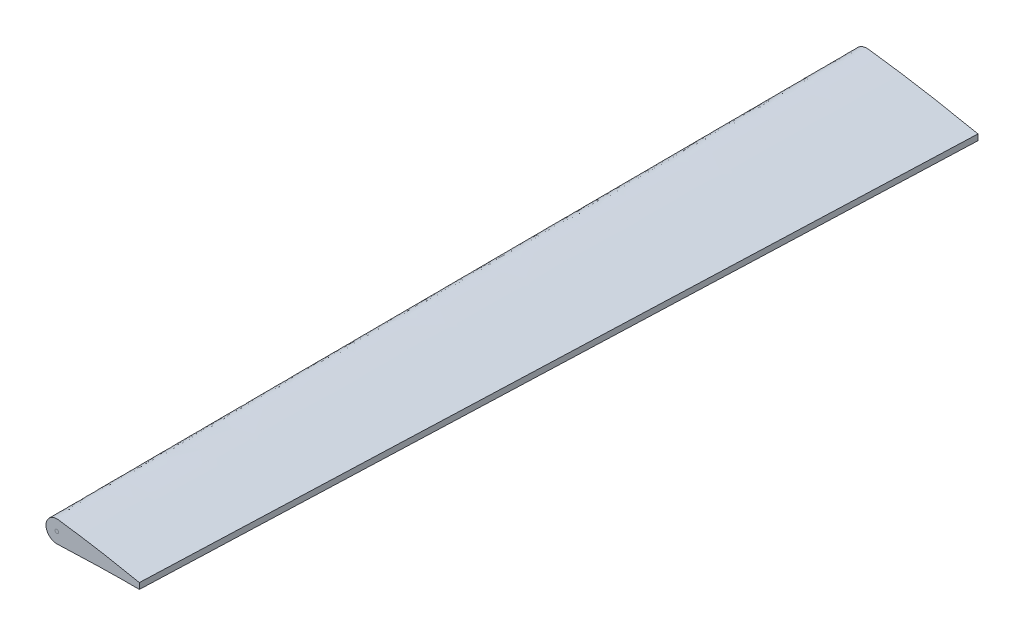
ISO-10303-21;
HEADER;
FILE_DESCRIPTION(('STEP AP214'),'2;1');
FILE_NAME('part.step','',(''),(''),'','','');
FILE_SCHEMA(('AUTOMOTIVE_DESIGN { 1 0 10303 214 1 1 1 1 }'));
ENDSEC;
DATA;
#1=APPLICATION_CONTEXT('core data for automotive mechanical design processes');
#2=APPLICATION_PROTOCOL_DEFINITION('international standard','automotive_design',2000,#1);
#3=PRODUCT_CONTEXT('',#1,'mechanical');
#4=PRODUCT('Part','Part','',(#3));
#5=PRODUCT_RELATED_PRODUCT_CATEGORY('part','',(#4));
#6=PRODUCT_DEFINITION_FORMATION('','',#4);
#7=PRODUCT_DEFINITION_CONTEXT('part definition',#1,'design');
#8=PRODUCT_DEFINITION('design','',#6,#7);
#9=PRODUCT_DEFINITION_SHAPE('','',#8);
#10=(LENGTH_UNIT() NAMED_UNIT(*) SI_UNIT(.MILLI.,.METRE.));
#11=(NAMED_UNIT(*) PLANE_ANGLE_UNIT() SI_UNIT($,.RADIAN.));
#12=(NAMED_UNIT(*) SI_UNIT($,.STERADIAN.) SOLID_ANGLE_UNIT());
#13=UNCERTAINTY_MEASURE_WITH_UNIT(LENGTH_MEASURE(1.E-05),#10,'distance_accuracy_value','');
#14=(GEOMETRIC_REPRESENTATION_CONTEXT(3) GLOBAL_UNCERTAINTY_ASSIGNED_CONTEXT((#13)) GLOBAL_UNIT_ASSIGNED_CONTEXT((#10,
#11,#12)) REPRESENTATION_CONTEXT('',''));
#15=CARTESIAN_POINT('',(0.,0.,0.));
#16=DIRECTION('',(0.,0.,1.));
#17=DIRECTION('',(1.,0.,0.));
#18=AXIS2_PLACEMENT_3D('',#15,#16,#17);
#19=CARTESIAN_POINT('',(183.169208283257,0.820924364598228,768.));
#20=DIRECTION('',(0.,0.,1.));
#21=DIRECTION('',(1.,0.,0.));
#22=AXIS2_PLACEMENT_3D('',#19,#20,#21);
#23=PLANE('',#22);
#24=CARTESIAN_POINT('',(206.591453535194,1.05306337090673,768.));
#25=CARTESIAN_POINT('',(206.072820369748,1.05867440583243,768.));
#26=CARTESIAN_POINT('',(205.554177136032,1.0633161421897,768.));
#27=CARTESIAN_POINT('',(204.516886984971,1.07076784708305,768.));
#28=CARTESIAN_POINT('',(203.998240067869,1.07357784930354,768.));
#29=CARTESIAN_POINT('',(202.96094494634,1.07747309489996,768.));
#30=CARTESIAN_POINT('',(202.442296741974,1.07855835496654,768.));
#31=CARTESIAN_POINT('',(201.405001150341,1.07911364602215,768.));
#32=CARTESIAN_POINT('',(200.886353763077,1.07858368193419,768.));
#33=CARTESIAN_POINT('',(199.849126637541,1.07601966145861,768.));
#34=CARTESIAN_POINT('',(199.330546898798,1.07398579015506,768.));
#35=CARTESIAN_POINT('',(198.293392480551,1.06852753866215,768.));
#36=CARTESIAN_POINT('',(197.774817801081,1.06510315214495,768.));
#37=CARTESIAN_POINT('',(196.737675534649,1.05697607318987,768.));
#38=CARTESIAN_POINT('',(196.219107947746,1.05227337332798,768.));
#39=CARTESIAN_POINT('',(195.181981838538,1.04171335205491,768.));
#40=CARTESIAN_POINT('',(194.663423316298,1.03585602436697,768.));
#41=CARTESIAN_POINT('',(193.315332111451,1.01923149482881,768.));
#42=CARTESIAN_POINT('',(192.485809654009,1.00762641888703,768.));
#43=CARTESIAN_POINT('',(190.826803609353,0.981814051540755,768.));
#44=CARTESIAN_POINT('',(189.997320022235,0.967606754103718,768.));
#45=CARTESIAN_POINT('',(188.338401634199,0.936763396129812,768.));
#46=CARTESIAN_POINT('',(187.508966833091,0.920127345826862,768.));
#47=CARTESIAN_POINT('',(185.850156167595,0.884597503648131,768.));
#48=CARTESIAN_POINT('',(185.020780302598,0.865703740099101,768.));
#49=CARTESIAN_POINT('',(183.362097422564,0.825837551664779,768.));
#50=CARTESIAN_POINT('',(182.532790406394,0.804865173747965,768.));
#51=CARTESIAN_POINT('',(180.873840319434,0.760994914159579,768.));
#52=CARTESIAN_POINT('',(180.04419727233,0.738096138887323,768.));
#53=CARTESIAN_POINT('',(178.384965146644,0.69053701485564,768.));
#54=CARTESIAN_POINT('',(177.555376067858,0.665876673233914,768.));
#55=CARTESIAN_POINT('',(175.896224118894,0.614953282205181,768.));
#56=CARTESIAN_POINT('',(175.066661250086,0.588690188263759,768.));
#57=CARTESIAN_POINT('',(173.407533971921,0.534720234276648,768.));
#58=CARTESIAN_POINT('',(172.577969565317,0.507013289808912,768.));
#59=CARTESIAN_POINT('',(170.918811327994,0.450316349264842,768.));
#60=CARTESIAN_POINT('',(170.089217501141,0.421326240146729,768.));
#61=CARTESIAN_POINT('',(168.976619497581,0.381681373079313,768.));
#62=CARTESIAN_POINT('',(168.693597292334,0.371530118190689,768.));
#63=CARTESIAN_POINT('',(168.127564996039,0.351100736342839,768.));
#64=CARTESIAN_POINT('',(167.844554904869,0.340822612766523,768.));
#65=CARTESIAN_POINT('',(167.278566031405,0.320145778385204,768.));
#66=CARTESIAN_POINT('',(166.99558724869,0.3097470791199,768.));
#67=CARTESIAN_POINT('',(166.429680176882,0.288835388437905,768.));
#68=CARTESIAN_POINT('',(166.14675188709,0.278322415961064,768.));
#69=CARTESIAN_POINT('',(165.580964987495,0.257188499596321,768.));
#70=CARTESIAN_POINT('',(165.298106376737,0.246567581290027,768.));
#71=CARTESIAN_POINT('',(164.732946642127,0.225241790940742,768.));
#72=CARTESIAN_POINT('',(164.45064551054,0.21453712386274,768.));
#73=CARTESIAN_POINT('',(163.886049357314,0.193028934324901,768.));
#74=CARTESIAN_POINT('',(163.603754335644,0.182225412685229,768.));
#75=CARTESIAN_POINT('',(163.039086756215,0.160521780542396,768.));
#76=CARTESIAN_POINT('',(162.756714199488,0.149621643172512,768.));
#77=CARTESIAN_POINT('',(162.191807908338,0.127726932793038,768.));
#78=CARTESIAN_POINT('',(161.909274175904,0.116732308441278,768.));
#79=CARTESIAN_POINT('',(161.343961896253,0.0946506534488053,768.));
#80=CARTESIAN_POINT('',(161.061183351874,0.0835635501553543,767.999999999999));
#81=CARTESIAN_POINT('',(160.690217538675,0.0689680083080822,768.));
#82=CARTESIAN_POINT('',(160.602028895653,0.0654944843248972,768.));
#83=CARTESIAN_POINT('',(160.425672698019,0.0585408600535823,768.));
#84=CARTESIAN_POINT('',(160.337505143337,0.055060761509368,768.));
#85=CARTESIAN_POINT('',(160.205290517871,0.0498367564630603,768.));
#86=CARTESIAN_POINT('',(160.161243343818,0.0480955011263788,768.));
#87=CARTESIAN_POINT('',(160.073147893504,0.0446109919486474,768.));
#88=CARTESIAN_POINT('',(160.029099617245,0.0428677380550966,768.));
#89=CARTESIAN_POINT('',(159.963058023809,0.0402532658392141,768.));
#90=CARTESIAN_POINT('',(159.941064698435,0.0393824533322958,768.));
#91=CARTESIAN_POINT('',(159.897077933674,0.0376394651725113,768.));
#92=CARTESIAN_POINT('',(159.875084494288,0.036767289507545,768.));
#93=CARTESIAN_POINT('',(159.842094645182,0.0354613562913556,768.));
#94=CARTESIAN_POINT('',(159.831098322245,0.0350264431362004,768.));
#95=CARTESIAN_POINT('',(159.809103192503,0.0342257583594533,768.));
#96=CARTESIAN_POINT('',(159.798104385713,0.0338599863266866,768.));
#97=CARTESIAN_POINT('',(159.765105703501,0.0328495154791118,768.));
#98=CARTESIAN_POINT('',(159.743103124341,0.0322916437264463,768.));
#99=CARTESIAN_POINT('',(159.69912456846,0.0314161836012234,768.));
#100=CARTESIAN_POINT('',(159.677148598521,0.0310982538845143,768.));
#101=CARTESIAN_POINT('',(159.633194167735,0.0306984195770186,768.));
#102=CARTESIAN_POINT('',(159.611215706853,0.0306165190008396,768.));
#103=CARTESIAN_POINT('',(159.545278869385,0.0307248188621574,768.));
#104=CARTESIAN_POINT('',(159.501320929616,0.0312690584065311,768.));
#105=CARTESIAN_POINT('',(159.369473906469,0.0343107130913118,768.));
#106=CARTESIAN_POINT('',(159.281613420923,0.0382170997001289,768.));
#107=CARTESIAN_POINT('',(159.106106785381,0.0497572538106592,768.));
#108=CARTESIAN_POINT('',(159.018460730941,0.0573924559545201,768.));
#109=CARTESIAN_POINT('',(158.84333121197,0.0763896327496934,768.));
#110=CARTESIAN_POINT('',(158.755848840588,0.0877617019287249,768.));
#111=CARTESIAN_POINT('',(158.581003783088,0.114270513879277,768.));
#112=CARTESIAN_POINT('',(158.49364393936,0.129426003540455,768.));
#113=CARTESIAN_POINT('',(158.319004642312,0.163578653169794,768.));
#114=CARTESIAN_POINT('',(158.231730605426,0.182603510752836,768.));
#115=CARTESIAN_POINT('',(158.144907160942,0.203503493131069,768.));
#116=B_SPLINE_CURVE_WITH_KNOTS('',3,(#24,#25,#26,#27,#28,#29,#30,#31,#32,#33,#34,#35,#36,#37,
#38,#39,#40,#41,#42,#43,#44,#45,#46,#47,#48,#49,#50,#51,#52,#53,#54,#55,#56,#57,#58,#59,#60,#61,
#62,#63,#64,#65,#66,#67,#68,#69,#70,#71,#72,#73,#74,#75,#76,#77,#78,#79,#80,#81,#82,#83,#84,#85,
#86,#87,#88,#89,#90,#91,#92,#93,#94,#95,#96,#97,#98,#99,#100,#101,#102,#103,#104,#105,#106,#107,
#108,#109,#110,#111,#112,#113,#114,#115),.UNSPECIFIED.,.F.,.F.,(4,2,2,2,2,2,2,2,2,2,2,2,2,2,2,2,
2,2,2,2,2,2,2,2,2,2,2,2,2,2,2,2,2,2,2,2,2,2,2,2,2,2,2,2,2,4),(0.,1.55598903548552,
3.11194945651517,4.66789482012995,6.22383544140583,7.77958460678026,9.33534085201238,
10.8911061327256,12.4468798710862,14.9356861157761,17.4244981301649,19.91329965787,
22.4020699627166,24.8907840439977,27.380659002332,29.8705238724998,32.3604579581076,
34.8505377940551,37.3408374345977,38.1904500068482,39.0400399731991,39.8895492898477,
40.7389198914492,41.5880936920454,42.435605720314,43.2831107234148,44.1308592942115,
44.9791020093599,45.8280894305099,46.0928604990676,46.357569131728,46.4898138622224,
46.6220621501826,46.6880938080644,46.75412605545,46.7871407274061,46.8201552030213,
46.8861828275104,46.952116342396,47.0180509787349,47.149925926152,47.4136812225375,
47.677538077426,47.9421136392906,48.2080271420873,48.4759156955911),.UNSPECIFIED.);
#117=CARTESIAN_POINT('',(159.83467645605,0.0351704092079654,768.));
#118=VERTEX_POINT('',#117);
#119=CARTESIAN_POINT('',(206.591453535194,1.05306337090673,768.));
#120=VERTEX_POINT('',#119);
#121=EDGE_CURVE('E374',#118,#120,#116,.F.);
#122=ORIENTED_EDGE('',*,*,#121,.T.);
#123=CARTESIAN_POINT('',(206.591453535194,1.05306337090673,768.));
#124=CARTESIAN_POINT('',(206.59145348529,1.33708285130722,767.999999999999));
#125=CARTESIAN_POINT('',(206.591453435962,1.62110233170771,767.999999999999));
#126=CARTESIAN_POINT('',(206.591453338523,2.18914129250869,767.999999999999));
#127=CARTESIAN_POINT('',(206.591453290412,2.47316077290919,768.));
#128=CARTESIAN_POINT('',(206.591453148017,3.32514661437409,768.000000000001));
#129=CARTESIAN_POINT('',(206.591453055657,3.8931129754385,768.000000000001));
#130=CARTESIAN_POINT('',(206.591452966129,4.46107933650291,768.));
#131=B_SPLINE_CURVE_WITH_KNOTS('',3,(#123,#124,#125,#126,#127,#128,#129,#130),.UNSPECIFIED.,.F.,
.F.,(4,2,2,4),(0.,0.85205844120149,1.70411688240298,3.40801596559624),.UNSPECIFIED.);
#132=CARTESIAN_POINT('',(206.591452966129,4.46107933650291,768.));
#133=VERTEX_POINT('',#132);
#134=EDGE_CURVE('E297',#120,#133,#131,.T.);
#135=ORIENTED_EDGE('',*,*,#134,.T.);
#136=CARTESIAN_POINT('',(206.591452966129,4.46107933650292,768.));
#137=CARTESIAN_POINT('',(206.083078798756,4.56448700045728,768.));
#138=CARTESIAN_POINT('',(205.574648445436,4.66761898848147,768.));
#139=CARTESIAN_POINT('',(204.557662273205,4.87325122317258,768.));
#140=CARTESIAN_POINT('',(204.04910645484,4.97575147252779,768.));
#141=CARTESIAN_POINT('',(203.031853837755,5.18004033919768,768.));
#142=CARTESIAN_POINT('',(202.523157039572,5.28182895918088,768.));
#143=CARTESIAN_POINT('',(201.50560691949,5.48461411873232,768.));
#144=CARTESIAN_POINT('',(200.996753597999,5.5856106603473,768.));
#145=CARTESIAN_POINT('',(199.979270916367,5.78665283082509,768.));
#146=CARTESIAN_POINT('',(199.470641690508,5.88669913909788,768.));
#147=CARTESIAN_POINT('',(198.453195768865,6.08583927334171,768.));
#148=CARTESIAN_POINT('',(197.944379072729,6.18493309751051,768.));
#149=CARTESIAN_POINT('',(196.926542922172,6.38208897618703,768.));
#150=CARTESIAN_POINT('',(196.417523466682,6.48015102517213,768.));
#151=CARTESIAN_POINT('',(195.399265151797,6.67515634285472,768.));
#152=CARTESIAN_POINT('',(194.890026290307,6.77209960061107,768.));
#153=CARTESIAN_POINT('',(193.565603619266,7.02264780906548,768.));
#154=CARTESIAN_POINT('',(192.750246355657,7.17533699847492,768.));
#155=CARTESIAN_POINT('',(191.118955838585,7.47764278554496,768.));
#156=CARTESIAN_POINT('',(190.30302258063,7.62725935896011,768.));
#157=CARTESIAN_POINT('',(188.670588460438,7.92333464370465,768.));
#158=CARTESIAN_POINT('',(187.85408760179,8.06979337481643,768.));
#159=CARTESIAN_POINT('',(186.22052873465,8.35947768197156,768.));
#160=CARTESIAN_POINT('',(185.403470737239,8.5027033204891,768.));
#161=CARTESIAN_POINT('',(183.768806561033,8.78583761756946,768.));
#162=CARTESIAN_POINT('',(182.95120040025,8.92574638010503,768.));
#163=CARTESIAN_POINT('',(181.31465225983,9.20235703400903,768.));
#164=CARTESIAN_POINT('',(180.495709747693,9.33905577483791,768.));
#165=CARTESIAN_POINT('',(178.85727836153,9.60912602272326,768.));
#166=CARTESIAN_POINT('',(178.037789488838,9.74249753787904,768.));
#167=CARTESIAN_POINT('',(176.398253157723,10.00592917581,768.));
#168=CARTESIAN_POINT('',(175.578205682494,10.1359891939965,768.));
#169=CARTESIAN_POINT('',(173.93754082764,10.392818345091,768.));
#170=CARTESIAN_POINT('',(173.116923414305,10.5195872626101,768.));
#171=CARTESIAN_POINT('',(171.475107401631,10.7698583588899,768.));
#172=CARTESIAN_POINT('',(170.653908752905,10.8933602138413,768.));
#173=CARTESIAN_POINT('',(169.485561738676,11.0666879592903,768.));
#174=CARTESIAN_POINT('',(169.138612653833,11.1178602224276,768.));
#175=CARTESIAN_POINT('',(168.444648469133,11.2196175370171,768.));
#176=CARTESIAN_POINT('',(168.097633374147,11.2702026216728,768.));
#177=CARTESIAN_POINT('',(167.403575186489,11.3707806729824,768.));
#178=CARTESIAN_POINT('',(167.056532107614,11.4207737348645,768.));
#179=CARTESIAN_POINT('',(166.362455932337,11.5201631693686,768.));
#180=CARTESIAN_POINT('',(166.015422858436,11.5695596991235,768.));
#181=CARTESIAN_POINT('',(165.32196636535,11.6676723931759,768.));
#182=CARTESIAN_POINT('',(164.975543110315,11.7163897177107,768.));
#183=CARTESIAN_POINT('',(164.282588934173,11.8132485964411,768.));
#184=CARTESIAN_POINT('',(163.936058006833,11.8613901060366,768.));
#185=CARTESIAN_POINT('',(163.242740594746,11.9571185217958,768.));
#186=CARTESIAN_POINT('',(162.895954069487,12.0047051345231,768.));
#187=CARTESIAN_POINT('',(162.201977402369,12.0993440395721,768.));
#188=CARTESIAN_POINT('',(161.854787186583,12.1463957899791,767.999999999999));
#189=CARTESIAN_POINT('',(161.415564265062,12.2055472264555,768.));
#190=CARTESIAN_POINT('',(161.323567748057,12.2179159863072,768.));
#191=CARTESIAN_POINT('',(161.185578718345,12.2364373579837,768.));
#192=CARTESIAN_POINT('',(161.139588249865,12.2426051960738,768.));
#193=CARTESIAN_POINT('',(161.047605894211,12.2549307267152,768.));
#194=CARTESIAN_POINT('',(161.001614007035,12.2610884192536,768.));
#195=CARTESIAN_POINT('',(160.909663585213,12.273389054215,768.));
#196=CARTESIAN_POINT('',(160.863705051587,12.2795320042618,768.));
#197=CARTESIAN_POINT('',(160.771786853504,12.2918076196971,768.));
#198=CARTESIAN_POINT('',(160.725827189053,12.2979402851388,768.));
#199=CARTESIAN_POINT('',(160.656916797087,12.3071280430059,768.));
#200=CARTESIAN_POINT('',(160.633966551961,12.3101867542185,768.));
#201=CARTESIAN_POINT('',(160.588065661129,12.3163009955859,768.));
#202=CARTESIAN_POINT('',(160.565115015422,12.3193565257438,768.));
#203=CARTESIAN_POINT('',(160.519213269718,12.3254676214191,768.));
#204=CARTESIAN_POINT('',(160.496262169721,12.328523186936,768.));
#205=CARTESIAN_POINT('',(160.46183428756,12.3330976446241,768.));
#206=CARTESIAN_POINT('',(160.450358098669,12.3346209851076,768.));
#207=CARTESIAN_POINT('',(160.427407332432,12.3376797960874,768.));
#208=CARTESIAN_POINT('',(160.415932755086,12.3392152665918,768.));
#209=CARTESIAN_POINT('',(160.381533628778,12.3437332334554,768.));
#210=CARTESIAN_POINT('',(160.358597954792,12.346632331889,768.));
#211=CARTESIAN_POINT('',(160.312694456586,12.3521600681145,768.));
#212=CARTESIAN_POINT('',(160.289726632789,12.3547887094201,768.));
#213=CARTESIAN_POINT('',(160.22078355074,12.3622868454034,768.));
#214=CARTESIAN_POINT('',(160.174765580828,12.3667689601221,768.));
#215=CARTESIAN_POINT('',(160.08258992064,12.3746970434061,768.));
#216=CARTESIAN_POINT('',(160.036432132569,12.3781418726182,768.));
#217=CARTESIAN_POINT('',(159.944048771234,12.3839934506771,768.));
#218=CARTESIAN_POINT('',(159.897823193967,12.3864001355483,768.));
#219=CARTESIAN_POINT('',(159.759098110705,12.3920638194442,768.));
#220=CARTESIAN_POINT('',(159.666530210699,12.3937661681514,768.));
#221=CARTESIAN_POINT('',(159.48119292982,12.3930370276348,768.));
#222=CARTESIAN_POINT('',(159.388423596861,12.3905956368738,768.));
#223=CARTESIAN_POINT('',(159.202631684054,12.3815501755921,768.));
#224=CARTESIAN_POINT('',(159.109610089064,12.3749257768135,768.));
#225=CARTESIAN_POINT('',(158.923267742387,12.3574413585305,768.));
#226=CARTESIAN_POINT('',(158.829949911902,12.3465502009,768.));
#227=CARTESIAN_POINT('',(158.73692712229,12.3335478052181,768.));
#228=B_SPLINE_CURVE_WITH_KNOTS('',3,(#136,#137,#138,#139,#140,#141,#142,#143,#144,#145,#146,
#147,#148,#149,#150,#151,#152,#153,#154,#155,#156,#157,#158,#159,#160,#161,#162,#163,#164,#165,
#166,#167,#168,#169,#170,#171,#172,#173,#174,#175,#176,#177,#178,#179,#180,#181,#182,#183,#184,
#185,#186,#187,#188,#189,#190,#191,#192,#193,#194,#195,#196,#197,#198,#199,#200,#201,#202,#203,
#204,#205,#206,#207,#208,#209,#210,#211,#212,#213,#214,#215,#216,#217,#218,#219,#220,#221,#222,
#223,#224,#225,#226,#227),.UNSPECIFIED.,.F.,.F.,(4,2,2,2,2,2,2,2,2,2,2,2,2,2,2,2,2,2,2,2,2,2,2,
2,2,2,2,2,2,2,2,2,2,2,2,2,2,2,2,2,2,2,2,2,2,4),(0.,1.55635382210182,3.11270101674535,
4.66904237215536,6.22537970465378,7.78050477238149,9.33563278206696,10.8907691114091,
12.4459206362378,14.9345070876211,17.4231131684546,19.9117036548116,22.4002460120134,
24.8887102584774,27.3795225938657,29.8703288653951,32.3612137080122,34.8522611598283,
37.3435545895078,38.3956618212097,39.4477092663536,40.4995851239819,41.5511775822718,
42.6006731848445,43.6502495569135,44.7003578513837,45.7514492161212,46.0299220255568,
46.1691286647163,46.3083354801835,46.4474372541519,46.5865383063864,46.6559978283046,
46.7254572807564,46.7949181009246,46.8296486490556,46.8643792205444,46.9337321105125,
47.0030840993462,47.1417786959956,47.2806250835462,47.4194800262646,47.697129617542,
47.9754435917566,48.2551206148397,48.5368778801175),.UNSPECIFIED.);
#229=CARTESIAN_POINT('',(160.405415659282,12.3405960297248,768.));
#230=VERTEX_POINT('',#229);
#231=EDGE_CURVE('E290',#133,#230,#228,.T.);
#232=ORIENTED_EDGE('',*,*,#231,.T.);
#233=CARTESIAN_POINT('',(162.14512642491,12.1069636745413,768.));
#234=CARTESIAN_POINT('',(162.035510084806,12.1218399591979,768.));
#235=CARTESIAN_POINT('',(161.925889828311,12.1366873840122,768.));
#236=CARTESIAN_POINT('',(161.706117309237,12.1663953718396,768.));
#237=CARTESIAN_POINT('',(161.59596500926,12.1812556581784,768.));
#238=CARTESIAN_POINT('',(161.375315523387,12.210963332091,768.));
#239=CARTESIAN_POINT('',(161.264818313446,12.2258105410857,768.));
#240=CARTESIAN_POINT('',(161.098991193972,12.2480476417154,768.));
#241=CARTESIAN_POINT('',(161.043664219564,12.255459427263,768.));
#242=CARTESIAN_POINT('',(160.933009290523,12.2702680038406,768.));
#243=CARTESIAN_POINT('',(160.877681335925,12.2776647951413,768.));
#244=CARTESIAN_POINT('',(160.766333054098,12.2925366227161,768.));
#245=CARTESIAN_POINT('',(160.710312703418,12.3000114834331,768.));
#246=CARTESIAN_POINT('',(160.626278473741,12.3112107733307,768.));
#247=CARTESIAN_POINT('',(160.598265478085,12.3149418318602,768.));
#248=CARTESIAN_POINT('',(160.542239465881,12.3224037973078,768.));
#249=CARTESIAN_POINT('',(160.514226449333,12.3261347042261,768.));
#250=CARTESIAN_POINT('',(160.472223397452,12.331715497024,768.));
#251=CARTESIAN_POINT('',(160.458234237856,12.3335719617856,768.));
#252=CARTESIAN_POINT('',(160.430258293838,12.3373027723064,768.));
#253=CARTESIAN_POINT('',(160.416271509417,12.3391771180727,768.));
#254=CARTESIAN_POINT('',(160.374295253115,12.3446732293866,768.));
#255=CARTESIAN_POINT('',(160.346288906092,12.3481682081998,768.));
#256=CARTESIAN_POINT('',(160.290232944259,12.3547561450665,768.));
#257=CARTESIAN_POINT('',(160.262183336111,12.357849159774,768.));
#258=CARTESIAN_POINT('',(160.206043759339,12.3636513311386,768.));
#259=CARTESIAN_POINT('',(160.177953789401,12.3663604750141,768.));
#260=CARTESIAN_POINT('',(160.093759267337,12.3738949679653,768.));
#261=CARTESIAN_POINT('',(160.037601830821,12.3781424291084,768.));
#262=CARTESIAN_POINT('',(159.925184439626,12.3851009753993,768.));
#263=CARTESIAN_POINT('',(159.868924470842,12.3878118301593,768.));
#264=CARTESIAN_POINT('',(159.75637659504,12.3916978585093,768.));
#265=CARTESIAN_POINT('',(159.700088712505,12.3928737326526,768.));
#266=CARTESIAN_POINT('',(159.587507225831,12.3936954920389,768.));
#267=CARTESIAN_POINT('',(159.531213622303,12.3933414768341,768.));
#268=CARTESIAN_POINT('',(159.358940853601,12.3899203489248,768.000000000001));
#269=CARTESIAN_POINT('',(159.243000690328,12.3843733429651,768.));
#270=CARTESIAN_POINT('',(159.011421587816,12.3667999064866,768.));
#271=CARTESIAN_POINT('',(158.895783494105,12.3547624920344,768.));
#272=CARTESIAN_POINT('',(158.66531298539,12.324212454756,768.));
#273=CARTESIAN_POINT('',(158.550480935247,12.3056970709819,768.));
#274=CARTESIAN_POINT('',(158.322656463141,12.2623315342665,768.));
#275=CARTESIAN_POINT('',(158.209657483252,12.237515831131,768.));
#276=CARTESIAN_POINT('',(157.985322027249,12.1815259954458,768.));
#277=CARTESIAN_POINT('',(157.873984502002,12.1503560749293,768.));
#278=CARTESIAN_POINT('',(157.653285095298,12.0817578501336,768.));
#279=CARTESIAN_POINT('',(157.543922861435,12.0443306746605,768.));
#280=CARTESIAN_POINT('',(157.273130257171,11.9430914711284,768.000000000001));
#281=CARTESIAN_POINT('',(157.113109561892,11.8754637502008,768.));
#282=CARTESIAN_POINT('',(156.799246988538,11.7270793793683,768.));
#283=CARTESIAN_POINT('',(156.645406806715,11.6463191555092,768.));
#284=CARTESIAN_POINT('',(156.344627937658,11.4720090000094,768.));
#285=CARTESIAN_POINT('',(156.197706793698,11.3784286864085,768.));
#286=CARTESIAN_POINT('',(155.912360226607,11.1792470624058,768.));
#287=CARTESIAN_POINT('',(155.773933432681,11.0736476994999,768.));
#288=CARTESIAN_POINT('',(155.372755896757,10.7394199371823,768.));
#289=CARTESIAN_POINT('',(155.124076787925,10.493343822763,768.));
#290=CARTESIAN_POINT('',(154.784810713451,10.0963330158925,768.));
#291=CARTESIAN_POINT('',(154.677330831112,9.95931893953802,768.));
#292=CARTESIAN_POINT('',(154.474185595306,9.67673242942557,768.));
#293=CARTESIAN_POINT('',(154.37851899484,9.53116090138343,768.));
#294=CARTESIAN_POINT('',(154.199695891948,9.23217157028243,768.));
#295=CARTESIAN_POINT('',(154.116562947177,9.07873970067399,768.));
#296=CARTESIAN_POINT('',(153.963771121545,8.76527997215542,768.));
#297=CARTESIAN_POINT('',(153.894113945148,8.6052512819566,768.));
#298=CARTESIAN_POINT('',(153.768634626081,8.28010941757204,768.));
#299=CARTESIAN_POINT('',(153.712794522261,8.11500316126974,768.));
#300=CARTESIAN_POINT('',(153.615144907828,7.78075496838022,768.));
#301=CARTESIAN_POINT('',(153.573330199127,7.61161455188147,768.));
#302=CARTESIAN_POINT('',(153.506908859578,7.28469653414947,768.));
#303=CARTESIAN_POINT('',(153.481156116346,7.1271507172416,768.));
#304=CARTESIAN_POINT('',(153.441910728231,6.81054753432011,768.));
#305=CARTESIAN_POINT('',(153.428417000719,6.65149030303763,768.));
#306=CARTESIAN_POINT('',(153.413356442292,6.31905682058032,768.));
#307=CARTESIAN_POINT('',(153.412918345379,6.14562847641832,768.));
#308=CARTESIAN_POINT('',(153.426582299067,5.79927641959848,768.));
#309=CARTESIAN_POINT('',(153.440691124681,5.62635297972371,768.));
#310=CARTESIAN_POINT('',(153.48326016137,5.28200470405367,768.));
#311=CARTESIAN_POINT('',(153.511742934446,5.11058265659942,768.));
#312=CARTESIAN_POINT('',(153.582903155281,4.77073989373642,768.));
#313=CARTESIAN_POINT('',(153.625578080153,4.60231865048806,768.));
#314=CARTESIAN_POINT('',(153.725000930987,4.26973225808266,768.));
#315=CARTESIAN_POINT('',(153.781744258085,4.10556573741817,768.));
#316=CARTESIAN_POINT('',(153.909137851439,3.78271525389468,768.));
#317=CARTESIAN_POINT('',(153.979788684496,3.62403151479691,768.));
#318=CARTESIAN_POINT('',(154.134121059072,3.3132193297408,768.));
#319=CARTESIAN_POINT('',(154.217797544606,3.16108836941101,768.));
#320=CARTESIAN_POINT('',(154.39749819652,2.86429597940454,768.));
#321=CARTESIAN_POINT('',(154.493523130888,2.71963501509376,768.000000000001));
#322=CARTESIAN_POINT('',(154.697363276029,2.43867049477843,768.000000000001));
#323=CARTESIAN_POINT('',(154.80518795905,2.30237379220149,768.));
#324=CARTESIAN_POINT('',(155.031897672185,2.03941353765607,768.));
#325=CARTESIAN_POINT('',(155.150781297093,1.91274876551117,768.));
#326=CARTESIAN_POINT('',(155.523155421036,1.54881911104347,768.));
#327=CARTESIAN_POINT('',(155.792566223802,1.32734611369295,767.999999999999));
#328=CARTESIAN_POINT('',(156.220446843125,1.03144705416277,768.));
#329=CARTESIAN_POINT('',(156.366893320658,0.938932131825909,768.));
#330=CARTESIAN_POINT('',(156.667001522633,0.766330367328141,768.));
#331=CARTESIAN_POINT('',(156.8206626874,0.68624256321094,768.));
#332=CARTESIAN_POINT('',(157.13421166224,0.539238656350521,768.));
#333=CARTESIAN_POINT('',(157.294101460592,0.472326801540306,768.));
#334=CARTESIAN_POINT('',(157.619026236487,0.352437405729902,768.));
#335=CARTESIAN_POINT('',(157.78406114447,0.299459676430611,768.000000000001));
#336=CARTESIAN_POINT('',(158.118325107551,0.207458696393354,768.000000000001));
#337=CARTESIAN_POINT('',(158.287562083818,0.168464342377666,768.));
#338=CARTESIAN_POINT('',(158.628715636609,0.104724230065241,768.));
#339=CARTESIAN_POINT('',(158.800632154624,0.0799781610985991,768.));
#340=CARTESIAN_POINT('',(159.059631764624,0.0536668401779493,768.));
#341=CARTESIAN_POINT('',(159.146196045653,0.0466969186238759,768.));
#342=CARTESIAN_POINT('',(159.276193793867,0.0389702474942521,768.));
#343=CARTESIAN_POINT('',(159.319547229441,0.036849468482469,768.));
#344=CARTESIAN_POINT('',(159.406288312954,0.0335205501535489,768.));
#345=CARTESIAN_POINT('',(159.449675960036,0.0323123886978262,768.));
#346=CARTESIAN_POINT('',(159.536455041802,0.0308133723698074,768.));
#347=CARTESIAN_POINT('',(159.579846472166,0.0305222654570593,768.));
#348=CARTESIAN_POINT('',(159.666628743709,0.0308593968251132,768.));
#349=CARTESIAN_POINT('',(159.710019584699,0.0314876897721215,768.));
#350=CARTESIAN_POINT('',(159.775090933736,0.0331281583126957,768.));
#351=CARTESIAN_POINT('',(159.796780682099,0.0337914026478224,768.));
#352=CARTESIAN_POINT('',(159.840152567995,0.0353431153652887,768.));
#353=CARTESIAN_POINT('',(159.861834705258,0.0362315910309447,768.));
#354=CARTESIAN_POINT('',(159.905196932582,0.0379730571362227,768.));
#355=CARTESIAN_POINT('',(159.926877022451,0.038826052959381,768.));
#356=CARTESIAN_POINT('',(159.970236015161,0.0405315741812594,768.));
#357=CARTESIAN_POINT('',(159.991914918002,0.04138409960347,768.));
#358=CARTESIAN_POINT('',(160.013593210432,0.042253869988621,768.));
#359=B_SPLINE_CURVE_WITH_KNOTS('',3,(#233,#234,#235,#236,#237,#238,#239,#240,#241,#242,#243,
#244,#245,#246,#247,#248,#249,#250,#251,#252,#253,#254,#255,#256,#257,#258,#259,#260,#261,#262,
#263,#264,#265,#266,#267,#268,#269,#270,#271,#272,#273,#274,#275,#276,#277,#278,#279,#280,#281,
#282,#283,#284,#285,#286,#287,#288,#289,#290,#291,#292,#293,#294,#295,#296,#297,#298,#299,#300,
#301,#302,#303,#304,#305,#306,#307,#308,#309,#310,#311,#312,#313,#314,#315,#316,#317,#318,#319,
#320,#321,#322,#323,#324,#325,#326,#327,#328,#329,#330,#331,#332,#333,#334,#335,#336,#337,#338,
#339,#340,#341,#342,#343,#344,#345,#346,#347,#348,#349,#350,#351,#352,#353,#354,#355,#356,#357,
#358),.UNSPECIFIED.,.F.,.F.,(4,2,2,2,2,2,2,2,2,2,2,2,2,2,2,2,2,2,2,2,2,2,2,2,2,2,2,2,2,2,2,2,2,
2,2,2,2,2,2,2,2,2,2,2,2,2,2,2,2,2,2,2,2,2,2,2,2,2,2,2,2,2,4),(0.,0.331863541091112,
0.66531399542776,0.999784690446554,1.16724835034565,1.3347089580754,1.50425947618661,
1.58904059729742,1.67382172038241,1.71615713279754,1.75849256235662,1.84316047553124,
1.92781644237927,2.01247522732276,2.18140547244238,2.35036103907909,2.51923946871855,
2.68810690933974,3.03612713887614,3.38473819168473,3.73349800591036,4.08039041583072,
4.42705362382983,4.77365436128724,5.29417755363307,5.81484264193434,6.33676370154146,
6.85860031220763,7.90216672840757,8.42414152291395,8.94606117102339,9.46894988195755,
9.99190468658449,10.5141760753805,11.036253685704,11.5146979524806,11.9930999623763,
12.5127526837833,13.032647535099,13.5533609870656,14.0739819231345,14.5944328957023,
15.1149050836929,15.6351757487022,16.1554787865331,16.6762026045661,17.1968603468441,
18.2371790842796,18.756413355378,19.2756074136042,19.7949685871918,20.3143227420206,
20.8347440429363,21.3551539961453,21.6156198182241,21.7458265384381,21.8760300999521,
22.0061978735959,22.1363733871447,22.2014718578521,22.2665724339205,22.3316630956429,
22.3967501432135),.UNSPECIFIED.);
#360=EDGE_CURVE('E332',#230,#118,#359,.T.);
#361=ORIENTED_EDGE('',*,*,#360,.T.);
#362=EDGE_LOOP('',(#122,#135,#232,#361));
#363=FACE_BOUND('',#362,.T.);
#364=CARTESIAN_POINT('',(159.590103920509,6.20652640506114,768.));
#365=DIRECTION('',(0.,0.,1.));
#366=DIRECTION('',(1.,0.,0.));
#367=AXIS2_PLACEMENT_3D('',#364,#365,#366);
#368=CIRCLE('',#367,0.999999999999998);
#369=CARTESIAN_POINT('',(160.590103920509,6.20652640506114,768.));
#370=VERTEX_POINT('',#369);
#371=EDGE_CURVE('E14',#370,#370,#368,.F.);
#372=ORIENTED_EDGE('',*,*,#371,.T.);
#373=EDGE_LOOP('',(#372));
#374=FACE_BOUND('',#373,.T.);
#375=ADVANCED_FACE('F256',(#363,#374),#23,.T.);
#376=CARTESIAN_POINT('',(192.776950816575,0.957675503741982,308.));
#377=DIRECTION('',(0.,0.,1.));
#378=DIRECTION('',(1.,0.,0.));
#379=AXIS2_PLACEMENT_3D('',#376,#377,#378);
#380=PLANE('',#379);
#381=CARTESIAN_POINT('',(161.370986878233,-0.128781387991317,308.));
#382=CARTESIAN_POINT('',(162.295291961937,-0.091109362923652,308.));
#383=CARTESIAN_POINT('',(165.442681735917,0.0360653378479363,308.));
#384=CARTESIAN_POINT('',(170.813433925149,0.246761928910896,308.));
#385=CARTESIAN_POINT('',(177.483749038682,0.492599829476538,308.));
#386=CARTESIAN_POINT('',(186.378766624947,0.791177847463482,308.));
#387=CARTESIAN_POINT('',(197.500478261508,1.09480020573656,308.));
#388=CARTESIAN_POINT('',(210.851522955218,1.29577053280732,308.));
#389=CARTESIAN_POINT('',(219.754952336931,1.2667968316258,308.));
#390=CARTESIAN_POINT('',(224.205950714496,1.18325322888217,308.));
#391=B_SPLINE_CURVE_WITH_KNOTS('',3,(#381,#382,#383,#384,#385,#386,#387,#388,#389,#390),
.UNSPECIFIED.,.F.,.F.,(4,1,1,1,1,1,1,4),(0.348421294396304,0.354837744724057,0.370269871605477,
0.385701998486896,0.401134125368315,0.431998379131154,0.462862632893992,0.493726886656831),.UNSPECIFIED.);
#392=CARTESIAN_POINT('',(161.370986878223,-0.128781387991733,308.));
#393=VERTEX_POINT('',#392);
#394=CARTESIAN_POINT('',(224.205950714482,1.18325322888237,308.));
#395=VERTEX_POINT('',#394);
#396=EDGE_CURVE('E320',#393,#395,#391,.T.);
#397=ORIENTED_EDGE('',*,*,#396,.F.);
#398=CARTESIAN_POINT('',(161.059665669644,7.50966584804336,308.));
#399=DIRECTION('',(0.,0.,1.));
#400=DIRECTION('',(1.,0.,0.));
#401=AXIS2_PLACEMENT_3D('',#398,#399,#400);
#402=CIRCLE('',#401,7.64478888345537);
#403=CARTESIAN_POINT('',(162.02269655386,15.0935545991162,308.));
#404=VERTEX_POINT('',#403);
#405=EDGE_CURVE('E267',#404,#393,#402,.T.);
#406=ORIENTED_EDGE('',*,*,#405,.F.);
#407=CARTESIAN_POINT('',(224.205950714484,4.54194939906442,308.));
#408=CARTESIAN_POINT('',(219.735450462304,5.45689250640466,308.));
#409=CARTESIAN_POINT('',(210.789818367064,7.26864094336778,308.));
#410=CARTESIAN_POINT('',(197.328868909359,9.78035024905577,308.));
#411=CARTESIAN_POINT('',(183.821425146476,12.038127544057,308.));
#412=CARTESIAN_POINT('',(172.046575705804,13.7789320611805,308.));
#413=CARTESIAN_POINT('',(164.772813069998,14.7443344000103,308.));
#414=CARTESIAN_POINT('',(162.02269655386,15.0935545991162,308.));
#415=B_SPLINE_CURVE_WITH_KNOTS('',3,(#407,#408,#409,#410,#411,#412,#413,#414),.UNSPECIFIED.,.F.,
.F.,(4,1,1,1,1,4),(0.493726886656831,0.525362632893992,0.556998379131154,0.588634125368315,
0.620269871605476,0.639480230998178),.UNSPECIFIED.);
#416=CARTESIAN_POINT('',(224.205950714478,4.54194939906512,308.));
#417=VERTEX_POINT('',#416);
#418=EDGE_CURVE('E306',#417,#404,#415,.T.);
#419=ORIENTED_EDGE('',*,*,#418,.F.);
#420=DIRECTION('',(-1.03297433770701E-12,1.,0.));
#421=VECTOR('',#420,1.);
#422=CARTESIAN_POINT('',(224.205950714482,1.18325322888237,308.));
#423=LINE('',#422,#421);
#424=EDGE_CURVE('E304',#395,#417,#423,.T.);
#425=ORIENTED_EDGE('',*,*,#424,.F.);
#426=EDGE_LOOP('',(#397,#406,#419,#425));
#427=FACE_BOUND('',#426,.T.);
#428=ADVANCED_FACE('F308',(#427),#380,.F.);
#429=ORIENTED_EDGE('',*,*,#371,.F.);
#430=EDGE_LOOP('',(#429));
#431=FACE_BOUND('',#430,.T.);
#432=ADVANCED_FACE('F258',(#431),#23,.T.);
#433=CARTESIAN_POINT('',(206.514876786189,1.05257573191463,770.));
#434=CARTESIAN_POINT('',(212.411283742181,1.09009780506608,616.));
#435=CARTESIAN_POINT('',(218.30831845743,1.13365572719496,462.));
#436=CARTESIAN_POINT('',(224.205950714496,1.18325322888217,308.));
#437=CARTESIAN_POINT('',(202.587599028079,1.09487742452873,770.));
#438=CARTESIAN_POINT('',(208.063312246251,1.15113945246313,616.));
#439=CARTESIAN_POINT('',(213.539591236518,1.21306552391732,462.));
#440=CARTESIAN_POINT('',(219.016408274429,1.28065903208789,308.));
#441=CARTESIAN_POINT('',(194.787914085741,1.06781392276521,769.999999999999));
#442=CARTESIAN_POINT('',(199.379183114904,1.137085333629,616.));
#443=CARTESIAN_POINT('',(203.970871220605,1.21105177815031,462.));
#444=CARTESIAN_POINT('',(208.562956773324,1.28971583876991,308.));
#445=CARTESIAN_POINT('',(183.171151541386,0.84316386775086,770.000000000001));
#446=CARTESIAN_POINT('',(186.372671702865,0.889654231052414,616.));
#447=CARTESIAN_POINT('',(189.574384740251,0.939069484325723,462.));
#448=CARTESIAN_POINT('',(192.776279026523,0.991410921708518,308.));
#449=CARTESIAN_POINT('',(171.556533009667,0.486879755875991,769.999999999999));
#450=CARTESIAN_POINT('',(173.369796649564,0.487121657234639,616.));
#451=CARTESIAN_POINT('',(175.18308281383,0.488561243935603,462.));
#452=CARTESIAN_POINT('',(176.996388271317,0.491198785436437,308.));
#453=CARTESIAN_POINT('',(163.760616890035,0.191731142569813,770.));
#454=CARTESIAN_POINT('',(164.692121169854,0.155008836620843,616.));
#455=CARTESIAN_POINT('',(165.623612976678,0.118601084264547,462.));
#456=CARTESIAN_POINT('',(166.555091961025,0.0825078714484343,308.));
#457=CARTESIAN_POINT('',(159.020181898076,0.00386558915919175,770.));
#458=CARTESIAN_POINT('',(159.445294370751,-0.0548957006563538,616.));
#459=CARTESIAN_POINT('',(159.870409437392,-0.113722245399445,462.));
#460=CARTESIAN_POINT('',(160.295527172113,-0.172614042081939,308.));
#461=CARTESIAN_POINT('',(157.33615734353,0.265807318605098,770.000000000001));
#462=CARTESIAN_POINT('',(157.619798819401,0.243227352178262,616.000000000001));
#463=CARTESIAN_POINT('',(157.905326401526,0.22042996669554,462.000000000001));
#464=CARTESIAN_POINT('',(158.19189462411,0.197503096530598,308.));
#465=CARTESIAN_POINT('',(155.110043916658,1.68947141779067,769.999999999999));
#466=CARTESIAN_POINT('',(155.263126038498,1.75575006779462,615.999999999999));
#467=CARTESIAN_POINT('',(155.422960390338,1.82161045695181,461.999999999999));
#468=CARTESIAN_POINT('',(155.586163833588,1.88736812475894,307.999999999999));
#469=CARTESIAN_POINT('',(153.652792013509,3.92448839759411,770.));
#470=CARTESIAN_POINT('',(153.707646854078,4.09277271448411,616.000000000001));
#471=CARTESIAN_POINT('',(153.772566754143,4.26055769909868,462.));
#472=CARTESIAN_POINT('',(153.841629232834,4.42831413555716,308.));
#473=CARTESIAN_POINT('',(153.382223497889,5.65459812034053,770.));
#474=CARTESIAN_POINT('',(153.386523063952,5.92626059446525,616.));
#475=CARTESIAN_POINT('',(153.399664613301,6.19751111291069,462.));
#476=CARTESIAN_POINT('',(153.414876786189,6.4687636701808,308.));
#477=CARTESIAN_POINT('',(153.42165029914,6.49568048291904,770.));
#478=CARTESIAN_POINT('',(153.414876786187,6.83388728262691,616.));
#479=CARTESIAN_POINT('',(153.414876786187,7.17177656533414,462.));
#480=CARTESIAN_POINT('',(153.414876786189,7.5096658478052,308.));
#481=CARTESIAN_POINT('',(153.46206243302,7.35778270685089,770.));
#482=CARTESIAN_POINT('',(153.443939108836,7.76419687081664,616.));
#483=CARTESIAN_POINT('',(153.430469133214,8.1703903166192,462.));
#484=CARTESIAN_POINT('',(153.414876786189,8.57658167216566,308.));
#485=CARTESIAN_POINT('',(153.909770673423,9.0643803198939,770.));
#486=CARTESIAN_POINT('',(153.895813945738,9.61352189710559,616.));
#487=CARTESIAN_POINT('',(153.883520029573,10.1624007662137,462.));
#488=CARTESIAN_POINT('',(153.866958719591,10.7110968427008,308.));
#489=CARTESIAN_POINT('',(155.557495361331,11.1192232726255,770.000000000001));
#490=CARTESIAN_POINT('',(155.640006111106,11.8710559960569,616.000000000001));
#491=CARTESIAN_POINT('',(155.72238137926,12.6223072042225,462.));
#492=CARTESIAN_POINT('',(155.801234178795,13.3729745256847,308.));
#493=CARTESIAN_POINT('',(157.871338042026,12.3211667810596,770.));
#494=CARTESIAN_POINT('',(158.142902694909,13.223218025609,616.));
#495=CARTESIAN_POINT('',(158.41415922265,14.1245640660729,462.));
#496=CARTESIAN_POINT('',(158.684263963423,15.0251946116569,308.));
#497=CARTESIAN_POINT('',(159.579802661083,12.4374327617076,770.));
#498=CARTESIAN_POINT('',(160.027461236715,13.3697269376734,616.));
#499=CARTESIAN_POINT('',(160.475072449401,14.3016641562983,462.));
#500=CARTESIAN_POINT('',(160.922638365608,15.2332441494899,308.));
#501=CARTESIAN_POINT('',(160.403742156061,12.3279170135396,770.));
#502=CARTESIAN_POINT('',(160.943393618263,13.2497962092164,616.));
#503=CARTESIAN_POINT('',(161.483045085956,14.1716754041798,462.));
#504=CARTESIAN_POINT('',(162.022696561031,15.0935545982311,308.));
#505=CARTESIAN_POINT('',(164.289568643825,11.8114237544443,770.));
#506=CARTESIAN_POINT('',(165.263072831259,12.6841842872545,616.));
#507=CARTESIAN_POINT('',(166.236800421073,13.5586282821857,462.));
#508=CARTESIAN_POINT('',(167.210741678316,14.4347570024683,308.));
#509=CARTESIAN_POINT('',(172.012513513308,10.7112653228614,770.));
#510=CARTESIAN_POINT('',(173.8824163628,11.4700480348314,616.));
#511=CARTESIAN_POINT('',(175.752877931574,12.2331405204995,462.));
#512=CARTESIAN_POINT('',(177.623873651979,13.0005459532416,308.));
#513=CARTESIAN_POINT('',(183.512556140777,8.8527221776234,769.999999999999));
#514=CARTESIAN_POINT('',(186.762312657267,9.3963722588567,615.999999999999));
#515=CARTESIAN_POINT('',(190.012858972669,9.94641237160136,461.999999999999));
#516=CARTESIAN_POINT('',(193.264159705472,10.5028470429702,307.999999999999));
#517=CARTESIAN_POINT('',(194.985854319103,6.77265366962411,770.000000000001));
#518=CARTESIAN_POINT('',(199.599745424496,7.06244244033202,616.000000000001));
#519=CARTESIAN_POINT('',(204.214448047606,7.35920492353638,462.000000000001));
#520=CARTESIAN_POINT('',(208.829924940502,7.66294582725963,308.));
#521=CARTESIAN_POINT('',(202.658505716521,5.24520544892301,770.));
#522=CARTESIAN_POINT('',(208.139033470827,5.35235768070327,616.));
#523=CARTESIAN_POINT('',(213.620289338107,5.46611678290073,462.));
#524=CARTESIAN_POINT('',(219.1022391326,5.58648702802898,308.));
#525=CARTESIAN_POINT('',(206.514876786189,4.46080949672058,770.));
#526=CARTESIAN_POINT('',(212.411239731082,4.48155990929691,616.));
#527=CARTESIAN_POINT('',(218.308275038076,4.50860521935417,462.));
#528=CARTESIAN_POINT('',(224.205950714478,4.54194939906512,308.));
#529=B_SPLINE_SURFACE_WITH_KNOTS('',3,3,((#433,#434,#435,#436),(#437,#438,#439,#440),(#441,#442,
#443,#444),(#445,#446,#447,#448),(#449,#450,#451,#452),(#453,#454,#455,#456),(#457,#458,#459,
#460),(#461,#462,#463,#464),(#465,#466,#467,#468),(#469,#470,#471,#472),(#473,#474,#475,#476),
(#477,#478,#479,#480),(#481,#482,#483,#484),(#485,#486,#487,#488),(#489,#490,#491,#492),(#493,
#494,#495,#496),(#497,#498,#499,#500),(#501,#502,#503,#504),(#505,#506,#507,#508),(#509,#510,
#511,#512),(#513,#514,#515,#516),(#517,#518,#519,#520),(#521,#522,#523,#524),(#525,#526,#527,
#528)),.UNSPECIFIED.,.F.,.F.,.F.,(4,1,1,1,2,1,1,1,3,1,1,1,3,1,1,1,4),(4,4),(0.0253839744418954,
0.125945930641001,0.226507886840107,0.327069843039212,0.427631799238318,0.448493709044973,
0.469355618851628,0.490217528658284,0.511079438464939,0.532462717487277,0.553845996509614,
0.575229275531952,0.596612554554289,0.697459415915717,0.798306277277145,0.899153138638572,1.),
(0.,1.),.UNSPECIFIED.);
#530=CARTESIAN_POINT('',(206.514876786189,4.46080949672058,770.));
#531=CARTESIAN_POINT('',(212.411239731082,4.48155990929691,616.));
#532=CARTESIAN_POINT('',(218.308275038076,4.50860521935417,462.));
#533=CARTESIAN_POINT('',(224.205950714478,4.54194939906512,308.));
#534=B_SPLINE_CURVE_WITH_KNOTS('',3,(#530,#531,#532,#533),.UNSPECIFIED.,.F.,.F.,(4,4),(0.,1.),.UNSPECIFIED.);
#535=EDGE_CURVE('E317',#133,#417,#534,.T.);
#536=CARTESIAN_POINT('',(206.514876786189,1.05257573191463,770.));
#537=CARTESIAN_POINT('',(212.411283742181,1.09009780506608,616.));
#538=CARTESIAN_POINT('',(218.30831845743,1.13365572719496,462.));
#539=CARTESIAN_POINT('',(224.205950714496,1.18325322888217,308.));
#540=B_SPLINE_CURVE_WITH_KNOTS('',3,(#536,#537,#538,#539),.UNSPECIFIED.,.F.,.F.,(4,4),(0.,1.),.UNSPECIFIED.);
#541=EDGE_CURVE('E318',#120,#395,#540,.T.);
#542=ORIENTED_EDGE('',*,*,#121,.F.);
#543=ORIENTED_EDGE('',*,*,#360,.F.);
#544=ORIENTED_EDGE('',*,*,#231,.F.);
#545=ORIENTED_EDGE('',*,*,#535,.T.);
#546=ORIENTED_EDGE('',*,*,#418,.T.);
#547=ORIENTED_EDGE('',*,*,#405,.T.);
#548=ORIENTED_EDGE('',*,*,#396,.T.);
#549=ORIENTED_EDGE('',*,*,#541,.F.);
#550=EDGE_LOOP('',(#542,#543,#544,#545,#546,#547,#548,#549));
#551=FACE_BOUND('',#550,.T.);
#552=ADVANCED_FACE('F325',(#551),#529,.T.);
#553=CARTESIAN_POINT('',(206.514876786189,4.46080949672058,770.));
#554=CARTESIAN_POINT('',(212.411239731082,4.48155990929691,616.));
#555=CARTESIAN_POINT('',(218.308275038076,4.50860521935417,462.));
#556=CARTESIAN_POINT('',(224.205950714478,4.54194939906512,308.));
#557=CARTESIAN_POINT('',(206.514876786189,4.17679001632009,770.));
#558=CARTESIAN_POINT('',(212.411243193318,4.19893611102211,616.));
#559=CARTESIAN_POINT('',(218.308278454311,4.22735747167431,462.));
#560=CARTESIAN_POINT('',(224.205950714479,4.26205805154989,308.));
#561=CARTESIAN_POINT('',(206.514876786189,3.6087510555191,770.));
#562=CARTESIAN_POINT('',(212.411250227301,3.63368953277303,616.));
#563=CARTESIAN_POINT('',(218.308285394545,3.66486299483313,462.));
#564=CARTESIAN_POINT('',(224.205950714479,3.70227535651943,308.));
#565=CARTESIAN_POINT('',(206.514876786189,2.75669261431761,770.));
#566=CARTESIAN_POINT('',(212.411261091434,2.78582262991231,616.));
#567=CARTESIAN_POINT('',(218.308296113017,2.82112424471019,462.));
#568=CARTESIAN_POINT('',(224.20595071448,2.86260131397375,308.));
#569=CARTESIAN_POINT('',(206.514876786189,1.90463417311612,770.));
#570=CARTESIAN_POINT('',(212.411272253349,1.93795860117584,616.));
#571=CARTESIAN_POINT('',(218.308307124442,1.97738836930929,462.));
#572=CARTESIAN_POINT('',(224.205950714481,2.02292727142805,308.));
#573=CARTESIAN_POINT('',(206.514876786189,1.33659521231513,770.));
#574=CARTESIAN_POINT('',(212.411279882897,1.37271777117527,616.));
#575=CARTESIAN_POINT('',(218.308314650582,1.41489964191221,462.));
#576=CARTESIAN_POINT('',(224.205950714481,1.4631445763976,308.));
#577=CARTESIAN_POINT('',(206.514876786189,1.05257573191463,770.));
#578=CARTESIAN_POINT('',(212.411283742181,1.09009780506608,616.));
#579=CARTESIAN_POINT('',(218.30831845743,1.13365572719496,462.));
#580=CARTESIAN_POINT('',(224.205950714496,1.18325322888217,308.));
#581=B_SPLINE_SURFACE_WITH_KNOTS('',3,3,((#553,#554,#555,#556),(#557,#558,#559,#560),(#561,#562,
#563,#564),(#565,#566,#567,#568),(#569,#570,#571,#572),(#573,#574,#575,#576),(#577,#578,#579,
#580)),.UNSPECIFIED.,.F.,.F.,.F.,(4,1,1,1,4),(4,4),(0.,0.00634599361047389,0.0126919872209477,
0.0190379808314216,0.0253839744418954),(0.,1.),.UNSPECIFIED.);
#582=ORIENTED_EDGE('',*,*,#134,.F.);
#583=ORIENTED_EDGE('',*,*,#541,.T.);
#584=ORIENTED_EDGE('',*,*,#424,.T.);
#585=ORIENTED_EDGE('',*,*,#535,.F.);
#586=EDGE_LOOP('',(#582,#583,#584,#585));
#587=FACE_BOUND('',#586,.T.);
#588=ADVANCED_FACE('F316',(#587),#581,.T.);
#589=CLOSED_SHELL('',(#375,#428,#432,#552,#588));
#590=MANIFOLD_SOLID_BREP('B2',#589);
#591=ADVANCED_BREP_SHAPE_REPRESENTATION('',(#18,#590),#14);
#592=SHAPE_DEFINITION_REPRESENTATION(#9,#591);
ENDSEC;
END-ISO-10303-21;
